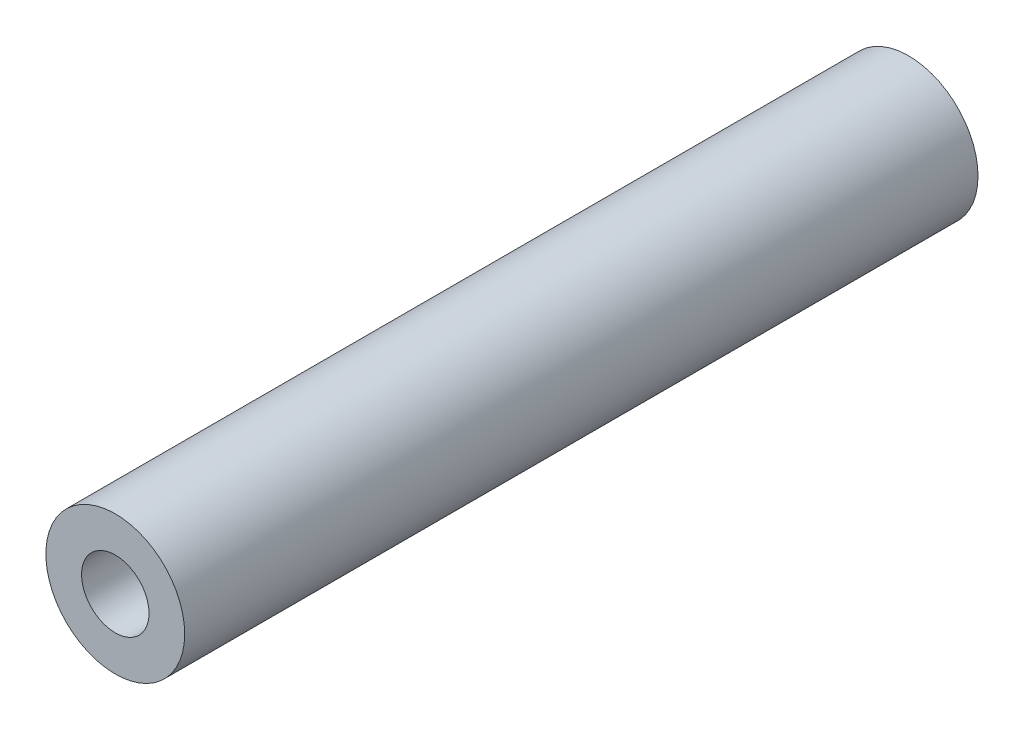
ISO-10303-21;
HEADER;
FILE_DESCRIPTION(('STEP AP214'),'2;1');
FILE_NAME('part.step','',(''),(''),'','','');
FILE_SCHEMA(('AUTOMOTIVE_DESIGN { 1 0 10303 214 1 1 1 1 }'));
ENDSEC;
DATA;
#1=APPLICATION_CONTEXT('core data for automotive mechanical design processes');
#2=APPLICATION_PROTOCOL_DEFINITION('international standard','automotive_design',2000,#1);
#3=PRODUCT_CONTEXT('',#1,'mechanical');
#4=PRODUCT('Part','Part','',(#3));
#5=PRODUCT_RELATED_PRODUCT_CATEGORY('part','',(#4));
#6=PRODUCT_DEFINITION_FORMATION('','',#4);
#7=PRODUCT_DEFINITION_CONTEXT('part definition',#1,'design');
#8=PRODUCT_DEFINITION('design','',#6,#7);
#9=PRODUCT_DEFINITION_SHAPE('','',#8);
#10=(LENGTH_UNIT() NAMED_UNIT(*) SI_UNIT(.MILLI.,.METRE.));
#11=(NAMED_UNIT(*) PLANE_ANGLE_UNIT() SI_UNIT($,.RADIAN.));
#12=(NAMED_UNIT(*) SI_UNIT($,.STERADIAN.) SOLID_ANGLE_UNIT());
#13=UNCERTAINTY_MEASURE_WITH_UNIT(LENGTH_MEASURE(1.E-05),#10,'distance_accuracy_value','');
#14=(GEOMETRIC_REPRESENTATION_CONTEXT(3) GLOBAL_UNCERTAINTY_ASSIGNED_CONTEXT((#13)) GLOBAL_UNIT_ASSIGNED_CONTEXT((#10,
#11,#12)) REPRESENTATION_CONTEXT('',''));
#15=CARTESIAN_POINT('',(0.,0.,0.));
#16=DIRECTION('',(0.,0.,1.));
#17=DIRECTION('',(1.,0.,0.));
#18=AXIS2_PLACEMENT_3D('',#15,#16,#17);
#19=CARTESIAN_POINT('',(-60.,-106.,189.4));
#20=DIRECTION('',(0.,0.,1.));
#21=DIRECTION('',(1.,0.,0.));
#22=AXIS2_PLACEMENT_3D('',#19,#20,#21);
#23=CYLINDRICAL_SURFACE('',#22,1.7);
#24=DIRECTION('',(0.,0.,1.));
#25=VECTOR('',#24,1.);
#26=CARTESIAN_POINT('',(-58.3,-106.,189.4));
#27=LINE('',#26,#25);
#28=CARTESIAN_POINT('',(-58.3,-106.,189.5));
#29=VERTEX_POINT('',#28);
#30=CARTESIAN_POINT('',(-58.3,-106.,229.5));
#31=VERTEX_POINT('',#30);
#32=EDGE_CURVE('E9',#29,#31,#27,.T.);
#33=ORIENTED_EDGE('',*,*,#32,.F.);
#34=CARTESIAN_POINT('',(-60.,-106.,189.5));
#35=DIRECTION('',(0.,0.,1.));
#36=DIRECTION('',(1.,0.,0.));
#37=AXIS2_PLACEMENT_3D('',#34,#35,#36);
#38=CIRCLE('',#37,1.7);
#39=EDGE_CURVE('E24',#29,#29,#38,.T.);
#40=ORIENTED_EDGE('',*,*,#39,.F.);
#41=ORIENTED_EDGE('',*,*,#32,.T.);
#42=CARTESIAN_POINT('',(-60.,-106.,229.5));
#43=DIRECTION('',(0.,0.,1.));
#44=DIRECTION('',(1.,0.,0.));
#45=AXIS2_PLACEMENT_3D('',#42,#43,#44);
#46=CIRCLE('',#45,1.7);
#47=EDGE_CURVE('E18',#31,#31,#46,.T.);
#48=ORIENTED_EDGE('',*,*,#47,.T.);
#49=EDGE_LOOP('',(#33,#40,#41,#48));
#50=FACE_BOUND('',#49,.T.);
#51=ADVANCED_FACE('F14',(#50),#23,.F.);
#52=CARTESIAN_POINT('',(-60.,-106.,189.5));
#53=DIRECTION('',(0.,0.,1.));
#54=DIRECTION('',(1.,0.,0.));
#55=AXIS2_PLACEMENT_3D('',#52,#53,#54);
#56=PLANE('',#55);
#57=ORIENTED_EDGE('',*,*,#39,.T.);
#58=EDGE_LOOP('',(#57));
#59=FACE_BOUND('',#58,.T.);
#60=CARTESIAN_POINT('',(-60.,-106.,189.5));
#61=DIRECTION('',(0.,0.,1.));
#62=DIRECTION('',(1.,0.,0.));
#63=AXIS2_PLACEMENT_3D('',#60,#61,#62);
#64=CIRCLE('',#63,3.5);
#65=CARTESIAN_POINT('',(-56.5,-106.,189.5));
#66=VERTEX_POINT('',#65);
#67=EDGE_CURVE('E55',#66,#66,#64,.T.);
#68=ORIENTED_EDGE('',*,*,#67,.F.);
#69=EDGE_LOOP('',(#68));
#70=FACE_BOUND('',#69,.T.);
#71=ADVANCED_FACE('F16',(#59,#70),#56,.F.);
#72=CARTESIAN_POINT('',(-60.,-106.,229.5));
#73=DIRECTION('',(0.,0.,1.));
#74=DIRECTION('',(1.,0.,0.));
#75=AXIS2_PLACEMENT_3D('',#72,#73,#74);
#76=PLANE('',#75);
#77=ORIENTED_EDGE('',*,*,#47,.F.);
#78=EDGE_LOOP('',(#77));
#79=FACE_BOUND('',#78,.T.);
#80=CARTESIAN_POINT('',(-60.,-106.,229.5));
#81=DIRECTION('',(0.,0.,1.));
#82=DIRECTION('',(1.,0.,0.));
#83=AXIS2_PLACEMENT_3D('',#80,#81,#82);
#84=CIRCLE('',#83,3.5);
#85=CARTESIAN_POINT('',(-56.5,-106.,229.5));
#86=VERTEX_POINT('',#85);
#87=EDGE_CURVE('E53',#86,#86,#84,.T.);
#88=ORIENTED_EDGE('',*,*,#87,.T.);
#89=EDGE_LOOP('',(#88));
#90=FACE_BOUND('',#89,.T.);
#91=ADVANCED_FACE('F59',(#79,#90),#76,.T.);
#92=CARTESIAN_POINT('',(-60.,-106.,189.5));
#93=DIRECTION('',(0.,0.,1.));
#94=DIRECTION('',(1.,0.,0.));
#95=AXIS2_PLACEMENT_3D('',#92,#93,#94);
#96=CYLINDRICAL_SURFACE('',#95,3.5);
#97=ORIENTED_EDGE('',*,*,#87,.F.);
#98=DIRECTION('',(0.,0.,1.));
#99=VECTOR('',#98,1.);
#100=CARTESIAN_POINT('',(-56.5,-106.,189.5));
#101=LINE('',#100,#99);
#102=EDGE_CURVE('E50',#66,#86,#101,.T.);
#103=ORIENTED_EDGE('',*,*,#102,.F.);
#104=ORIENTED_EDGE('',*,*,#67,.T.);
#105=ORIENTED_EDGE('',*,*,#102,.T.);
#106=EDGE_LOOP('',(#97,#103,#104,#105));
#107=FACE_BOUND('',#106,.T.);
#108=ADVANCED_FACE('F52',(#107),#96,.T.);
#109=CLOSED_SHELL('',(#51,#71,#91,#108));
#110=MANIFOLD_SOLID_BREP('B1',#109);
#111=ADVANCED_BREP_SHAPE_REPRESENTATION('',(#18,#110),#14);
#112=SHAPE_DEFINITION_REPRESENTATION(#9,#111);
ENDSEC;
END-ISO-10303-21;
